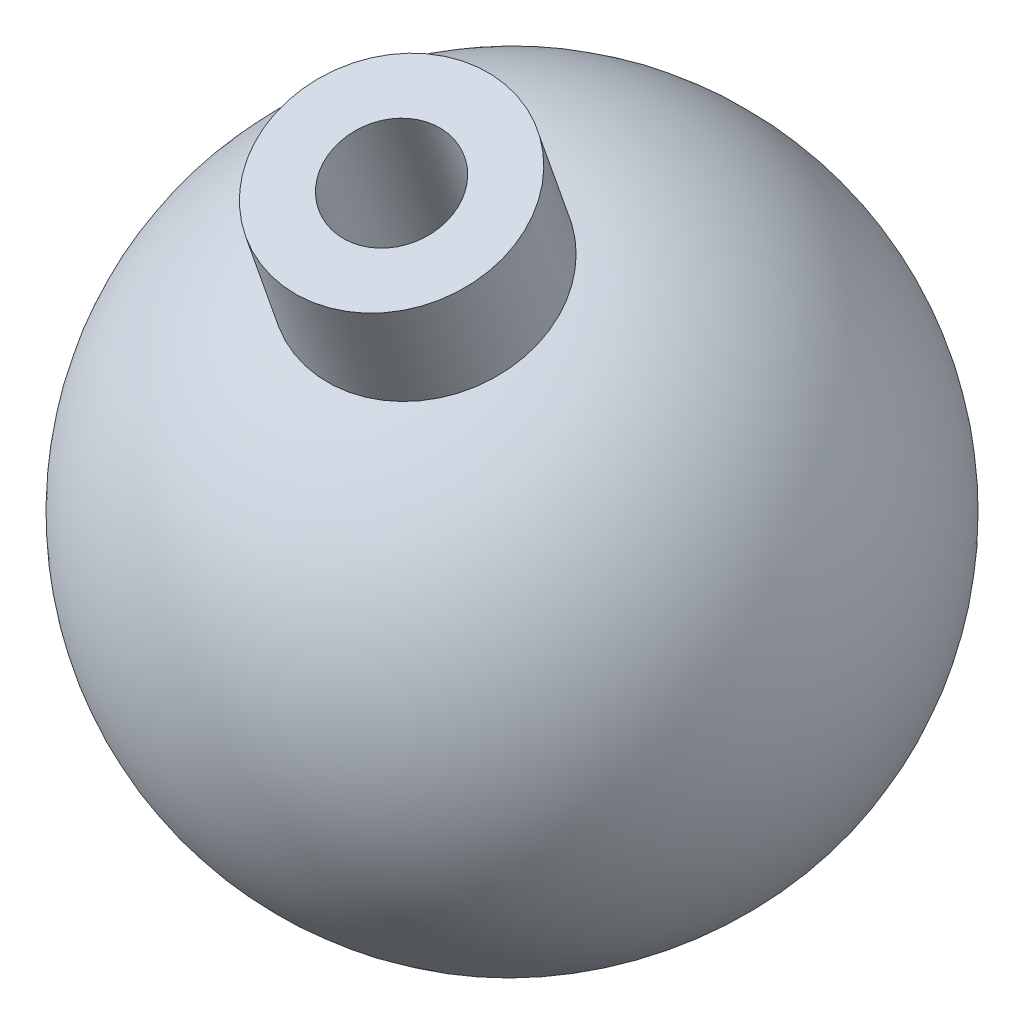
ISO-10303-21;
HEADER;
FILE_DESCRIPTION(('STEP AP214'),'2;1');
FILE_NAME('part.step','',(''),(''),'','','');
FILE_SCHEMA(('AUTOMOTIVE_DESIGN { 1 0 10303 214 1 1 1 1 }'));
ENDSEC;
DATA;
#1=APPLICATION_CONTEXT('core data for automotive mechanical design processes');
#2=APPLICATION_PROTOCOL_DEFINITION('international standard','automotive_design',2000,#1);
#3=PRODUCT_CONTEXT('',#1,'mechanical');
#4=PRODUCT('Part','Part','',(#3));
#5=PRODUCT_RELATED_PRODUCT_CATEGORY('part','',(#4));
#6=PRODUCT_DEFINITION_FORMATION('','',#4);
#7=PRODUCT_DEFINITION_CONTEXT('part definition',#1,'design');
#8=PRODUCT_DEFINITION('design','',#6,#7);
#9=PRODUCT_DEFINITION_SHAPE('','',#8);
#10=(LENGTH_UNIT() NAMED_UNIT(*) SI_UNIT(.MILLI.,.METRE.));
#11=(NAMED_UNIT(*) PLANE_ANGLE_UNIT() SI_UNIT($,.RADIAN.));
#12=(NAMED_UNIT(*) SI_UNIT($,.STERADIAN.) SOLID_ANGLE_UNIT());
#13=UNCERTAINTY_MEASURE_WITH_UNIT(LENGTH_MEASURE(1.E-05),#10,'distance_accuracy_value','');
#14=(GEOMETRIC_REPRESENTATION_CONTEXT(3) GLOBAL_UNCERTAINTY_ASSIGNED_CONTEXT((#13)) GLOBAL_UNIT_ASSIGNED_CONTEXT((#10,
#11,#12)) REPRESENTATION_CONTEXT('',''));
#15=CARTESIAN_POINT('',(0.,0.,0.));
#16=DIRECTION('',(0.,0.,1.));
#17=DIRECTION('',(1.,0.,0.));
#18=AXIS2_PLACEMENT_3D('',#15,#16,#17);
#19=CARTESIAN_POINT('',(-23.3826859021799,-90.,-19.));
#20=DIRECTION('',(-0.103809544750828,-0.916038966713815,-0.387422495320693));
#21=DIRECTION('',(0.994597194053264,-0.0956101512020633,-0.0404366240986165));
#22=AXIS2_PLACEMENT_3D('',#19,#20,#21);
#23=SPHERICAL_SURFACE('',#22,4.49999999999999);
#24=CARTESIAN_POINT('',(-23.6258420320829,-92.1456648376717,-19.9074710309702));
#25=DIRECTION('',(-0.103809544750828,-0.916038966713815,-0.387422495320693));
#26=DIRECTION('',(0.,0.389527034298012,-0.921015032206855));
#27=AXIS2_PLACEMENT_3D('',#24,#25,#26);
#28=CIRCLE('',#27,3.84232921921324);
#29=CARTESIAN_POINT('',(-19.8042721720246,-92.5130305152887,-20.0628418532706));
#30=VERTEX_POINT('',#29);
#31=EDGE_CURVE('E10',#30,#30,#28,.T.);
#32=CARTESIAN_POINT('',(-22.9422593039087,-86.1135758088333,-17.3563055582472));
#33=DIRECTION('',(-0.103809544750828,-0.916038966713815,-0.387422495320693));
#34=DIRECTION('',(0.,0.389527034298012,-0.921015032206855));
#35=AXIS2_PLACEMENT_3D('',#32,#33,#34);
#36=CIRCLE('',#35,1.5);
#37=CARTESIAN_POINT('',(-21.4503635128288,-86.2569910356363,-17.4169604943951));
#38=VERTEX_POINT('',#37);
#39=EDGE_CURVE('E62',#38,#38,#36,.T.);
#40=CARTESIAN_POINT('',(-19.8042721720246,-92.5130305152887,-20.0628418532706));
#41=CARTESIAN_POINT('',(-19.7537232932553,-92.4519770899122,-20.0370203857711));
#42=CARTESIAN_POINT('',(-19.7050206426366,-92.3896273909668,-20.0106506822698));
#43=CARTESIAN_POINT('',(-19.6114488480763,-92.2625338025971,-19.9568986947074));
#44=CARTESIAN_POINT('',(-19.5665797041347,-92.1977899131727,-19.9295164106463));
#45=CARTESIAN_POINT('',(-19.4808159733046,-92.0661063005033,-19.8738231534084));
#46=CARTESIAN_POINT('',(-19.4399213864161,-91.9991665772584,-19.8455121802315));
#47=CARTESIAN_POINT('',(-19.3622323754743,-91.8632984149138,-19.7880491416459));
#48=CARTESIAN_POINT('',(-19.325437951421,-91.7943699758141,-19.7588970762372));
#49=CARTESIAN_POINT('',(-19.2560630611508,-91.6547371097825,-19.6998418227464));
#50=CARTESIAN_POINT('',(-19.2234825949338,-91.5840326828506,-19.6699386346643));
#51=CARTESIAN_POINT('',(-19.1626361755734,-91.4410661953721,-19.6094734848848));
#52=CARTESIAN_POINT('',(-19.13437022243,-91.3688041348256,-19.5789115231875));
#53=CARTESIAN_POINT('',(-19.082240122934,-91.2229455059544,-19.5172231933078));
#54=CARTESIAN_POINT('',(-19.0583759765814,-91.1493489376299,-19.4860968251254));
#55=CARTESIAN_POINT('',(-19.0151231759465,-91.001048550001,-19.423375796523));
#56=CARTESIAN_POINT('',(-18.9957345216642,-90.9263447306968,-19.391781136103));
#57=CARTESIAN_POINT('',(-18.9614925752142,-90.7760605141878,-19.3282210821283));
#58=CARTESIAN_POINT('',(-18.9466392830464,-90.700480116983,-19.2962556885737));
#59=CARTESIAN_POINT('',(-18.9215139252098,-90.5486761252203,-19.2320528725086));
#60=CARTESIAN_POINT('',(-18.911241859541,-90.4724525306623,-19.1998154499982));
#61=CARTESIAN_POINT('',(-18.895310673294,-90.3195975106363,-19.1351681200999));
#62=CARTESIAN_POINT('',(-18.8896515527157,-90.2429660851682,-19.1027582127121));
#63=CARTESIAN_POINT('',(-18.882963731107,-90.0895320291355,-19.037865989766));
#64=CARTESIAN_POINT('',(-18.8819350300766,-90.0127293985709,-19.0053836742076));
#65=CARTESIAN_POINT('',(-18.8845112240357,-89.859190086799,-18.9404469352064));
#66=CARTESIAN_POINT('',(-18.8881161190252,-89.7824534055918,-18.9079925117634));
#67=CARTESIAN_POINT('',(-18.8999483736733,-89.6292829433511,-18.8432117711541));
#68=CARTESIAN_POINT('',(-18.908175733332,-89.5528491623176,-18.8108854539877));
#69=CARTESIAN_POINT('',(-18.9292275125248,-89.4005205159317,-18.74646074452));
#70=CARTESIAN_POINT('',(-18.942051932059,-89.3246256505793,-18.7143623522187));
#71=CARTESIAN_POINT('',(-18.9722582312101,-89.1736091869761,-18.6504926072737));
#72=CARTESIAN_POINT('',(-18.9896401108269,-89.0984875887253,-18.6187212546301));
#73=CARTESIAN_POINT('',(-19.02890765763,-88.9492496230186,-18.5556036939459));
#74=CARTESIAN_POINT('',(-19.0507933248162,-88.8751332555627,-18.5242574859053));
#75=CARTESIAN_POINT('',(-19.099000867256,-88.728134611144,-18.4620870065929));
#76=CARTESIAN_POINT('',(-19.1253227425096,-88.6552523341813,-18.431262735321));
#77=CARTESIAN_POINT('',(-19.1823214232689,-88.51094691977,-18.3702313100531));
#78=CARTESIAN_POINT('',(-19.2129982287746,-88.4395237823215,-18.340024156057));
#79=CARTESIAN_POINT('',(-19.278612044882,-88.2983571903656,-18.2803202402862));
#80=CARTESIAN_POINT('',(-19.3135490554838,-88.2286137358583,-18.2508234785115));
#81=CARTESIAN_POINT('',(-19.3875754017842,-88.0910218666162,-18.1926314285501));
#82=CARTESIAN_POINT('',(-19.4266647374829,-88.0231734518816,-18.1639361403635));
#83=CARTESIAN_POINT('',(-19.508875032247,-87.8895811674254,-18.1074356441179));
#84=CARTESIAN_POINT('',(-19.5519959913124,-87.8238372977039,-18.079630436059));
#85=CARTESIAN_POINT('',(-19.6421363820734,-87.6946571100324,-18.0249959581904));
#86=CARTESIAN_POINT('',(-19.689155813769,-87.6312207920824,-17.9981666883807));
#87=CARTESIAN_POINT('',(-19.7869479611339,-87.5068515892722,-17.9455669315531));
#88=CARTESIAN_POINT('',(-19.8377206768032,-87.4459187044121,-17.9197964445352));
#89=CARTESIAN_POINT('',(-19.9428626140898,-87.3267445191996,-17.8693938286088));
#90=CARTESIAN_POINT('',(-19.9972318357072,-87.2685032188472,-17.8447616997004));
#91=CARTESIAN_POINT('',(-20.1093989007398,-87.154892041731,-17.7967118597546));
#92=CARTESIAN_POINT('',(-20.167196744155,-87.0995221649672,-17.7732941487173));
#93=CARTESIAN_POINT('',(-20.2860425841226,-86.9918248118839,-17.7277454561539));
#94=CARTESIAN_POINT('',(-20.3470905806749,-86.9394973355644,-17.7056144746278));
#95=CARTESIAN_POINT('',(-20.4722482128333,-86.8380463497988,-17.6627075727533));
#96=CARTESIAN_POINT('',(-20.5363578484392,-86.7889228403527,-17.6419316524048));
#97=CARTESIAN_POINT('',(-20.6674408260681,-86.6940315210249,-17.6017990455463));
#98=CARTESIAN_POINT('',(-20.7344141680909,-86.6482637111432,-17.5824423590362));
#99=CARTESIAN_POINT('',(-20.8710176514732,-86.5602249393013,-17.5452079160579));
#100=CARTESIAN_POINT('',(-20.9406477928326,-86.517953977341,-17.5273301595897));
#101=CARTESIAN_POINT('',(-21.0823502557939,-86.4370400822175,-17.4931090573288));
#102=CARTESIAN_POINT('',(-21.1544225773958,-86.3983971490542,-17.4767657115361));
#103=CARTESIAN_POINT('',(-21.3007854053862,-86.324856191136,-17.4456628627925));
#104=CARTESIAN_POINT('',(-21.3750759117748,-86.2899581663812,-17.4309033598417));
#105=CARTESIAN_POINT('',(-21.4503635128288,-86.2569910356363,-17.4169604943951));
#106=B_SPLINE_CURVE_WITH_KNOTS('',3,(#40,#41,#42,#43,#44,#45,#46,#47,#48,#49,#50,#51,#52,#53,
#54,#55,#56,#57,#58,#59,#60,#61,#62,#63,#64,#65,#66,#67,#68,#69,#70,#71,#72,#73,#74,#75,#76,#77,
#78,#79,#80,#81,#82,#83,#84,#85,#86,#87,#88,#89,#90,#91,#92,#93,#94,#95,#96,#97,#98,#99,#100,
#101,#102,#103,#104,#105),.UNSPECIFIED.,.F.,.F.,(4,2,2,2,2,2,2,2,2,2,2,2,2,2,2,2,2,2,2,2,2,2,2,
2,2,2,2,2,2,2,2,2,4),(0.,0.250057630485919,0.500115260971834,0.750172891457757,1.00023052194367,
1.25028815242958,1.5003457829155,1.75040341340141,2.00046104388733,2.25051867437325,
2.50057630485917,2.75063393534508,3.000691565831,3.25074919631691,3.50080682680283,
3.75086445728875,4.00092208777466,4.25097971826057,4.50103734874649,4.75109497923241,
5.00115260971833,5.25121024020424,5.50126787069015,5.75132550117607,6.00138313166198,
6.2514407621479,6.50149839263382,6.75155602311973,7.00161365360565,7.25167128409157,
7.50172891457748,7.7517865450634,8.00184417554932),.UNSPECIFIED.);
#107=EDGE_CURVE('BSEAM39',#30,#38,#106,.T.);
#108=ORIENTED_EDGE('',*,*,#31,.F.);
#109=ORIENTED_EDGE('',*,*,#39,.T.);
#110=ORIENTED_EDGE('',*,*,#107,.T.);
#111=ORIENTED_EDGE('',*,*,#107,.F.);
#112=EDGE_LOOP('',(#108,#110,#109,#111));
#113=FACE_BOUND('',#112,.T.);
#114=ADVANCED_FACE('F39',(#113),#23,.T.);
#115=CARTESIAN_POINT('',(-23.6258420320829,-92.1456648376717,-19.9074710309702));
#116=DIRECTION('',(-0.103809544750828,-0.916038966713815,-0.387422495320693));
#117=DIRECTION('',(0.,0.389527034298012,-0.921015032206855));
#118=AXIS2_PLACEMENT_3D('',#115,#116,#117);
#119=CONICAL_SURFACE('',#118,3.84232921921324,0.785398163397463);
#120=CARTESIAN_POINT('',(-23.5186486878665,-91.1997664570333,-19.5074200241212));
#121=DIRECTION('',(-0.103809544750828,-0.916038966713815,-0.387422495320693));
#122=DIRECTION('',(0.,0.389527034298012,-0.921015032206855));
#123=AXIS2_PLACEMENT_3D('',#120,#121,#122);
#124=CIRCLE('',#123,2.80973299240458);
#125=CARTESIAN_POINT('',(-23.5186486878665,-90.1052994973327,-22.0952263466134));
#126=VERTEX_POINT('',#125);
#127=EDGE_CURVE('E44',#126,#126,#124,.T.);
#128=ORIENTED_EDGE('',*,*,#127,.F.);
#129=EDGE_LOOP('',(#128));
#130=FACE_BOUND('',#129,.T.);
#131=ORIENTED_EDGE('',*,*,#31,.T.);
#132=EDGE_LOOP('',(#131));
#133=FACE_BOUND('',#132,.T.);
#134=ADVANCED_FACE('F93',(#130,#133),#119,.F.);
#135=CARTESIAN_POINT('',(-23.3826859021799,-90.,-19.));
#136=DIRECTION('',(-0.103809544750828,-0.916038966713815,-0.387422495320693));
#137=DIRECTION('',(0.994597194053264,-0.0956101512020633,-0.0404366240986165));
#138=AXIS2_PLACEMENT_3D('',#135,#136,#137);
#139=SPHERICAL_SURFACE('',#138,3.1);
#140=ORIENTED_EDGE('',*,*,#127,.T.);
#141=EDGE_LOOP('',(#140));
#142=FACE_BOUND('',#141,.T.);
#143=ADVANCED_FACE('F88',(#142),#139,.F.);
#144=CARTESIAN_POINT('',(-22.2837855544871,-86.9571751265746,-17.7130909839836));
#145=DIRECTION('',(-0.103809544750828,-0.916038966713815,-0.387422495320693));
#146=DIRECTION('',(0.,0.389527034298012,-0.921015032206855));
#147=AXIS2_PLACEMENT_3D('',#144,#145,#146);
#148=PLANE('',#147);
#149=CARTESIAN_POINT('',(-23.029733450027,-86.885467513173,-17.6827635159096));
#150=DIRECTION('',(-0.103809544750828,-0.916038966713815,-0.387422495320693));
#151=DIRECTION('',(0.,0.389527034298012,-0.921015032206855));
#152=AXIS2_PLACEMENT_3D('',#149,#150,#151);
#153=CIRCLE('',#152,0.750000000000001);
#154=CARTESIAN_POINT('',(-23.029733450027,-86.5933222374495,-18.3735247900648));
#155=VERTEX_POINT('',#154);
#156=EDGE_CURVE('E47',#155,#155,#153,.T.);
#157=ORIENTED_EDGE('',*,*,#156,.F.);
#158=EDGE_LOOP('',(#157));
#159=FACE_BOUND('',#158,.T.);
#160=ADVANCED_FACE('F82',(#159),#148,.F.);
#161=CARTESIAN_POINT('',(-24.4207813496881,-99.1603896671381,-22.8742249532069));
#162=DIRECTION('',(-0.103809544750828,-0.916038966713815,-0.387422495320693));
#163=DIRECTION('',(0.,0.389527034298012,-0.921015032206855));
#164=AXIS2_PLACEMENT_3D('',#161,#162,#163);
#165=CYLINDRICAL_SURFACE('',#164,0.750000000000001);
#166=CARTESIAN_POINT('',(-22.780590542625,-84.6869739930599,-16.75294952714));
#167=DIRECTION('',(-0.103809544750828,-0.916038966713815,-0.387422495320693));
#168=DIRECTION('',(0.,0.389527034298012,-0.921015032206855));
#169=AXIS2_PLACEMENT_3D('',#166,#167,#168);
#170=CIRCLE('',#169,0.750000000000003);
#171=CARTESIAN_POINT('',(-22.780590542625,-84.3948287173364,-17.4437108012951));
#172=VERTEX_POINT('',#171);
#173=EDGE_CURVE('E52',#172,#172,#170,.T.);
#174=CARTESIAN_POINT('',(-22.780590542625,-84.3948287173364,-17.4437108012951));
#175=CARTESIAN_POINT('',(-22.7831857812438,-84.4177296915042,-17.4533963636781));
#176=CARTESIAN_POINT('',(-22.7857810198626,-84.4406306656721,-17.4630819260612));
#177=CARTESIAN_POINT('',(-22.7909714971001,-84.4864326140078,-17.4824530508272));
#178=CARTESIAN_POINT('',(-22.7935667357189,-84.5093335881756,-17.4921386132102));
#179=CARTESIAN_POINT('',(-22.7987572129564,-84.5551355365113,-17.5115097379762));
#180=CARTESIAN_POINT('',(-22.8013524515752,-84.5780365106791,-17.5211953003593));
#181=CARTESIAN_POINT('',(-22.8065429288128,-84.6238384590148,-17.5405664251253));
#182=CARTESIAN_POINT('',(-22.8091381674315,-84.6467394331827,-17.5502519875083));
#183=CARTESIAN_POINT('',(-22.8143286446691,-84.6925413815184,-17.5696231122743));
#184=CARTESIAN_POINT('',(-22.8169238832878,-84.7154423556862,-17.5793086746574));
#185=CARTESIAN_POINT('',(-22.8221143605254,-84.7612443040219,-17.5986797994234));
#186=CARTESIAN_POINT('',(-22.8247095991441,-84.7841452781897,-17.6083653618064));
#187=CARTESIAN_POINT('',(-22.8299000763817,-84.8299472265254,-17.6277364865725));
#188=CARTESIAN_POINT('',(-22.8324953150005,-84.8528482006933,-17.6374220489555));
#189=CARTESIAN_POINT('',(-22.837685792238,-84.898650149029,-17.6567931737215));
#190=CARTESIAN_POINT('',(-22.8402810308568,-84.9215511231968,-17.6664787361045));
#191=CARTESIAN_POINT('',(-22.8454715080943,-84.9673530715325,-17.6858498608706));
#192=CARTESIAN_POINT('',(-22.8480667467131,-84.9902540457004,-17.6955354232536));
#193=CARTESIAN_POINT('',(-22.8532572239506,-85.036055994036,-17.7149065480196));
#194=CARTESIAN_POINT('',(-22.8558524625694,-85.0589569682039,-17.7245921104026));
#195=CARTESIAN_POINT('',(-22.8610429398069,-85.1047589165396,-17.7439632351687));
#196=CARTESIAN_POINT('',(-22.8636381784257,-85.1276598907074,-17.7536487975517));
#197=CARTESIAN_POINT('',(-22.8688286556633,-85.1734618390431,-17.7730199223177));
#198=CARTESIAN_POINT('',(-22.871423894282,-85.196362813211,-17.7827054847007));
#199=CARTESIAN_POINT('',(-22.8766143715196,-85.2421647615466,-17.8020766094668));
#200=CARTESIAN_POINT('',(-22.8792096101383,-85.2650657357145,-17.8117621718498));
#201=CARTESIAN_POINT('',(-22.8844000873759,-85.3108676840502,-17.8311332966158));
#202=CARTESIAN_POINT('',(-22.8869953259946,-85.333768658218,-17.8408188589988));
#203=CARTESIAN_POINT('',(-22.8921858032322,-85.3795706065537,-17.8601899837649));
#204=CARTESIAN_POINT('',(-22.894781041851,-85.4024715807216,-17.8698755461479));
#205=CARTESIAN_POINT('',(-22.8999715190885,-85.4482735290572,-17.8892466709139));
#206=CARTESIAN_POINT('',(-22.9025667577073,-85.4711745032251,-17.8989322332969));
#207=CARTESIAN_POINT('',(-22.9077572349448,-85.5169764515608,-17.918303358063));
#208=CARTESIAN_POINT('',(-22.9103524735636,-85.5398774257286,-17.927988920446));
#209=CARTESIAN_POINT('',(-22.9155429508011,-85.5856793740643,-17.947360045212));
#210=CARTESIAN_POINT('',(-22.9181381894199,-85.6085803482322,-17.957045607595));
#211=CARTESIAN_POINT('',(-22.9233286666574,-85.6543822965679,-17.9764167323611));
#212=CARTESIAN_POINT('',(-22.9259239052762,-85.6772832707357,-17.9861022947441));
#213=CARTESIAN_POINT('',(-22.9311143825137,-85.7230852190714,-18.0054734195101));
#214=CARTESIAN_POINT('',(-22.9337096211325,-85.7459861932392,-18.0151589818931));
#215=CARTESIAN_POINT('',(-22.9389000983701,-85.7917881415749,-18.0345301066592));
#216=CARTESIAN_POINT('',(-22.9414953369888,-85.8146891157428,-18.0442156690422));
#217=CARTESIAN_POINT('',(-22.9466858142264,-85.8604910640785,-18.0635867938082));
#218=CARTESIAN_POINT('',(-22.9492810528451,-85.8833920382463,-18.0732723561912));
#219=CARTESIAN_POINT('',(-22.9544715300827,-85.929193986582,-18.0926434809573));
#220=CARTESIAN_POINT('',(-22.9570667687015,-85.9520949607498,-18.1023290433403));
#221=CARTESIAN_POINT('',(-22.962257245939,-85.9978969090855,-18.1217001681063));
#222=CARTESIAN_POINT('',(-22.9648524845578,-86.0207978832534,-18.1313857304893));
#223=CARTESIAN_POINT('',(-22.9700429617953,-86.0665998315891,-18.1507568552554));
#224=CARTESIAN_POINT('',(-22.9726382004141,-86.0895008057569,-18.1604424176384));
#225=CARTESIAN_POINT('',(-22.9778286776516,-86.1353027540926,-18.1798135424044));
#226=CARTESIAN_POINT('',(-22.9804239162704,-86.1582037282605,-18.1894991047875));
#227=CARTESIAN_POINT('',(-22.9856143935079,-86.2040056765961,-18.2088702295535));
#228=CARTESIAN_POINT('',(-22.9882096321267,-86.226906650764,-18.2185557919365));
#229=CARTESIAN_POINT('',(-22.9934001093642,-86.2727085990997,-18.2379269167025));
#230=CARTESIAN_POINT('',(-22.995995347983,-86.2956095732675,-18.2476124790856));
#231=CARTESIAN_POINT('',(-23.0011858252206,-86.3414115216032,-18.2669836038516));
#232=CARTESIAN_POINT('',(-23.0037810638393,-86.3643124957711,-18.2766691662346));
#233=CARTESIAN_POINT('',(-23.0089715410769,-86.4101144441068,-18.2960402910006));
#234=CARTESIAN_POINT('',(-23.0115667796956,-86.4330154182746,-18.3057258533837));
#235=CARTESIAN_POINT('',(-23.0167572569332,-86.4788173666103,-18.3250969781497));
#236=CARTESIAN_POINT('',(-23.0193524955519,-86.5017183407781,-18.3347825405327));
#237=CARTESIAN_POINT('',(-23.0245429727895,-86.5475202891138,-18.3541536652987));
#238=CARTESIAN_POINT('',(-23.0271382114083,-86.5704212632817,-18.3638392276818));
#239=CARTESIAN_POINT('',(-23.029733450027,-86.5933222374495,-18.3735247900648));
#240=B_SPLINE_CURVE_WITH_KNOTS('',3,(#174,#175,#176,#177,#178,#179,#180,#181,#182,#183,#184,
#185,#186,#187,#188,#189,#190,#191,#192,#193,#194,#195,#196,#197,#198,#199,#200,#201,#202,#203,
#204,#205,#206,#207,#208,#209,#210,#211,#212,#213,#214,#215,#216,#217,#218,#219,#220,#221,#222,
#223,#224,#225,#226,#227,#228,#229,#230,#231,#232,#233,#234,#235,#236,#237,#238,#239),
.UNSPECIFIED.,.F.,.F.,(4,2,2,2,2,2,2,2,2,2,2,2,2,2,2,2,2,2,2,2,2,2,2,2,2,2,2,2,2,2,2,2,4),(0.,
0.0750000000000125,0.149999999999998,0.225000000000011,0.299999999999998,0.37500000000001,
0.449999999999998,0.52500000000001,0.599999999999996,0.675000000000008,0.749999999999995,
0.825000000000008,0.899999999999994,0.975000000000006,1.04999999999999,1.12500000000001,
1.19999999999999,1.27500000000001,1.34999999999999,1.425,1.49999999999999,1.575,
1.64999999999999,1.725,1.79999999999999,1.875,1.94999999999999,2.025,2.09999999999999,2.175,
2.24999999999999,2.325,2.39999999999999),.UNSPECIFIED.);
#241=EDGE_CURVE('BSEAM73',#172,#155,#240,.T.);
#242=ORIENTED_EDGE('',*,*,#173,.F.);
#243=ORIENTED_EDGE('',*,*,#156,.T.);
#244=ORIENTED_EDGE('',*,*,#241,.T.);
#245=ORIENTED_EDGE('',*,*,#241,.F.);
#246=EDGE_LOOP('',(#242,#244,#243,#245));
#247=FACE_BOUND('',#246,.T.);
#248=ADVANCED_FACE('F73',(#247),#165,.F.);
#249=CARTESIAN_POINT('',(-21.2886947515452,-84.830389219863,-16.8136044632879));
#250=DIRECTION('',(-0.103809544750828,-0.916038966713815,-0.387422495320693));
#251=DIRECTION('',(0.,0.389527034298012,-0.921015032206855));
#252=AXIS2_PLACEMENT_3D('',#249,#250,#251);
#253=PLANE('',#252);
#254=CARTESIAN_POINT('',(-22.780590542625,-84.6869739930599,-16.75294952714));
#255=DIRECTION('',(-0.103809544750828,-0.916038966713815,-0.387422495320693));
#256=DIRECTION('',(0.,0.389527034298012,-0.921015032206855));
#257=AXIS2_PLACEMENT_3D('',#254,#255,#256);
#258=CIRCLE('',#257,1.5);
#259=CARTESIAN_POINT('',(-22.780590542625,-84.1026834416129,-18.1344720754503));
#260=VERTEX_POINT('',#259);
#261=EDGE_CURVE('E59',#260,#260,#258,.T.);
#262=ORIENTED_EDGE('',*,*,#261,.F.);
#263=EDGE_LOOP('',(#262));
#264=FACE_BOUND('',#263,.T.);
#265=ORIENTED_EDGE('',*,*,#173,.T.);
#266=EDGE_LOOP('',(#265));
#267=FACE_BOUND('',#266,.T.);
#268=ADVANCED_FACE('F66',(#264,#267),#253,.F.);
#269=CARTESIAN_POINT('',(-24.4207813496881,-99.1603896671381,-22.8742249532069));
#270=DIRECTION('',(-0.103809544750828,-0.916038966713815,-0.387422495320693));
#271=DIRECTION('',(0.,0.389527034298012,-0.921015032206855));
#272=AXIS2_PLACEMENT_3D('',#269,#270,#271);
#273=CYLINDRICAL_SURFACE('',#272,1.5);
#274=ORIENTED_EDGE('',*,*,#39,.F.);
#275=EDGE_LOOP('',(#274));
#276=FACE_BOUND('',#275,.T.);
#277=ORIENTED_EDGE('',*,*,#261,.T.);
#278=EDGE_LOOP('',(#277));
#279=FACE_BOUND('',#278,.T.);
#280=ADVANCED_FACE('F67',(#276,#279),#273,.T.);
#281=CLOSED_SHELL('',(#114,#134,#143,#160,#248,#268,#280));
#282=MANIFOLD_SOLID_BREP('B2',#281);
#283=ADVANCED_BREP_SHAPE_REPRESENTATION('',(#18,#282),#14);
#284=SHAPE_DEFINITION_REPRESENTATION(#9,#283);
ENDSEC;
END-ISO-10303-21;
